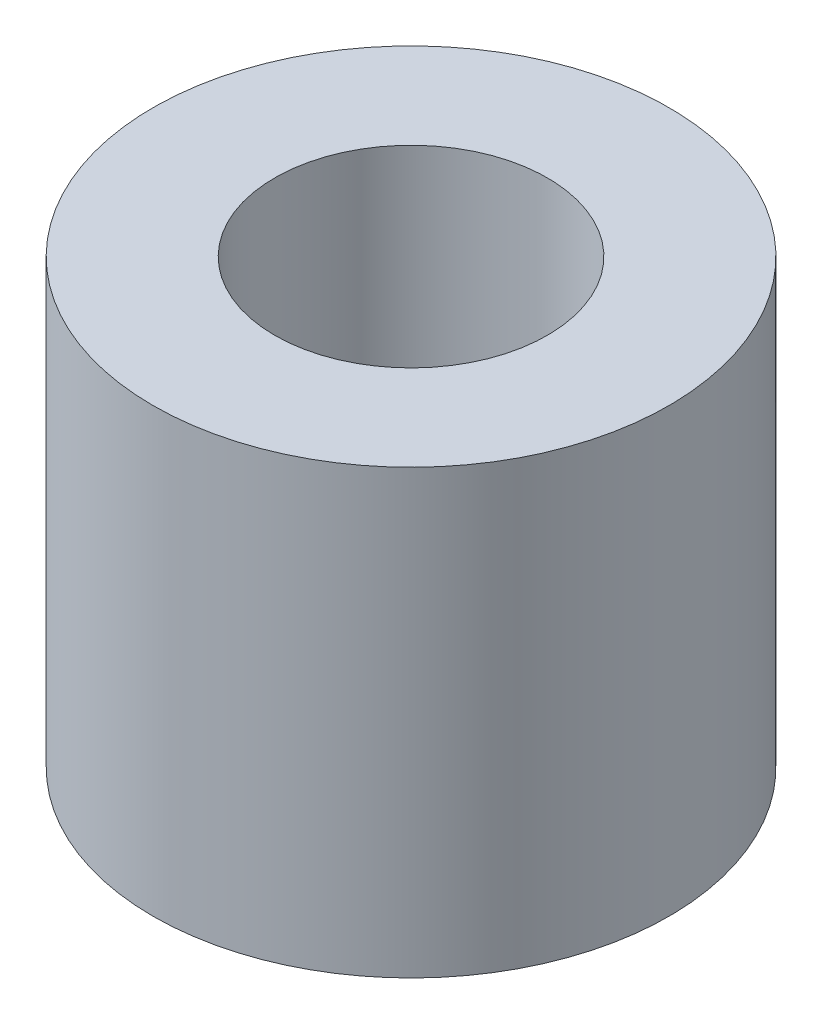
ISO-10303-21;
HEADER;
FILE_DESCRIPTION(('STEP AP214'),'2;1');
FILE_NAME('part.step','',(''),(''),'','','');
FILE_SCHEMA(('AUTOMOTIVE_DESIGN { 1 0 10303 214 1 1 1 1 }'));
ENDSEC;
DATA;
#1=APPLICATION_CONTEXT('core data for automotive mechanical design processes');
#2=APPLICATION_PROTOCOL_DEFINITION('international standard','automotive_design',2000,#1);
#3=PRODUCT_CONTEXT('',#1,'mechanical');
#4=PRODUCT('Part','Part','',(#3));
#5=PRODUCT_RELATED_PRODUCT_CATEGORY('part','',(#4));
#6=PRODUCT_DEFINITION_FORMATION('','',#4);
#7=PRODUCT_DEFINITION_CONTEXT('part definition',#1,'design');
#8=PRODUCT_DEFINITION('design','',#6,#7);
#9=PRODUCT_DEFINITION_SHAPE('','',#8);
#10=(LENGTH_UNIT() NAMED_UNIT(*) SI_UNIT(.MILLI.,.METRE.));
#11=(NAMED_UNIT(*) PLANE_ANGLE_UNIT() SI_UNIT($,.RADIAN.));
#12=(NAMED_UNIT(*) SI_UNIT($,.STERADIAN.) SOLID_ANGLE_UNIT());
#13=UNCERTAINTY_MEASURE_WITH_UNIT(LENGTH_MEASURE(1.E-05),#10,'distance_accuracy_value','');
#14=(GEOMETRIC_REPRESENTATION_CONTEXT(3) GLOBAL_UNCERTAINTY_ASSIGNED_CONTEXT((#13)) GLOBAL_UNIT_ASSIGNED_CONTEXT((#10,
#11,#12)) REPRESENTATION_CONTEXT('',''));
#15=CARTESIAN_POINT('',(0.,0.,0.));
#16=DIRECTION('',(0.,0.,1.));
#17=DIRECTION('',(1.,0.,0.));
#18=AXIS2_PLACEMENT_3D('',#15,#16,#17);
#19=CARTESIAN_POINT('',(0.,6.,0.));
#20=DIRECTION('',(0.,1.,0.));
#21=DIRECTION('',(0.,0.,1.));
#22=AXIS2_PLACEMENT_3D('',#19,#20,#21);
#23=PLANE('',#22);
#24=CARTESIAN_POINT('',(0.,6.,0.));
#25=DIRECTION('',(0.,1.,0.));
#26=DIRECTION('',(0.,0.,1.));
#27=AXIS2_PLACEMENT_3D('',#24,#25,#26);
#28=CIRCLE('',#27,3.5);
#29=CARTESIAN_POINT('',(0.,6.,3.5));
#30=VERTEX_POINT('',#29);
#31=EDGE_CURVE('E10',#30,#30,#28,.T.);
#32=ORIENTED_EDGE('',*,*,#31,.T.);
#33=EDGE_LOOP('',(#32));
#34=FACE_BOUND('',#33,.T.);
#35=CARTESIAN_POINT('',(0.,6.,0.));
#36=DIRECTION('',(0.,1.,0.));
#37=DIRECTION('',(0.,0.,1.));
#38=AXIS2_PLACEMENT_3D('',#35,#36,#37);
#39=CIRCLE('',#38,1.85);
#40=CARTESIAN_POINT('',(0.,6.,1.85));
#41=VERTEX_POINT('',#40);
#42=EDGE_CURVE('E45',#41,#41,#39,.T.);
#43=ORIENTED_EDGE('',*,*,#42,.F.);
#44=EDGE_LOOP('',(#43));
#45=FACE_BOUND('',#44,.T.);
#46=ADVANCED_FACE('F34',(#34,#45),#23,.T.);
#47=CARTESIAN_POINT('',(0.,0.,0.));
#48=DIRECTION('',(0.,1.,0.));
#49=DIRECTION('',(0.,0.,1.));
#50=AXIS2_PLACEMENT_3D('',#47,#48,#49);
#51=PLANE('',#50);
#52=CARTESIAN_POINT('',(0.,0.,0.));
#53=DIRECTION('',(0.,1.,0.));
#54=DIRECTION('',(0.,0.,1.));
#55=AXIS2_PLACEMENT_3D('',#52,#53,#54);
#56=CIRCLE('',#55,3.5);
#57=CARTESIAN_POINT('',(0.,0.,3.5));
#58=VERTEX_POINT('',#57);
#59=EDGE_CURVE('E38',#58,#58,#56,.T.);
#60=ORIENTED_EDGE('',*,*,#59,.F.);
#61=EDGE_LOOP('',(#60));
#62=FACE_BOUND('',#61,.T.);
#63=CARTESIAN_POINT('',(0.,0.,0.));
#64=DIRECTION('',(0.,1.,0.));
#65=DIRECTION('',(0.,0.,1.));
#66=AXIS2_PLACEMENT_3D('',#63,#64,#65);
#67=CIRCLE('',#66,1.85);
#68=CARTESIAN_POINT('',(0.,0.,1.85));
#69=VERTEX_POINT('',#68);
#70=EDGE_CURVE('E47',#69,#69,#67,.T.);
#71=ORIENTED_EDGE('',*,*,#70,.T.);
#72=EDGE_LOOP('',(#71));
#73=FACE_BOUND('',#72,.T.);
#74=ADVANCED_FACE('F57',(#62,#73),#51,.F.);
#75=CARTESIAN_POINT('',(0.,6.,0.));
#76=DIRECTION('',(0.,-1.,0.));
#77=DIRECTION('',(0.,0.,-1.));
#78=AXIS2_PLACEMENT_3D('',#75,#76,#77);
#79=CYLINDRICAL_SURFACE('',#78,3.5);
#80=ORIENTED_EDGE('',*,*,#31,.F.);
#81=EDGE_LOOP('',(#80));
#82=FACE_BOUND('',#81,.T.);
#83=ORIENTED_EDGE('',*,*,#59,.T.);
#84=EDGE_LOOP('',(#83));
#85=FACE_BOUND('',#84,.T.);
#86=ADVANCED_FACE('F36',(#82,#85),#79,.T.);
#87=CARTESIAN_POINT('',(0.,6.,0.));
#88=DIRECTION('',(0.,-1.,0.));
#89=DIRECTION('',(0.,0.,-1.));
#90=AXIS2_PLACEMENT_3D('',#87,#88,#89);
#91=CYLINDRICAL_SURFACE('',#90,1.85);
#92=ORIENTED_EDGE('',*,*,#42,.T.);
#93=EDGE_LOOP('',(#92));
#94=FACE_BOUND('',#93,.T.);
#95=ORIENTED_EDGE('',*,*,#70,.F.);
#96=EDGE_LOOP('',(#95));
#97=FACE_BOUND('',#96,.T.);
#98=ADVANCED_FACE('F53',(#94,#97),#91,.F.);
#99=CLOSED_SHELL('',(#46,#74,#86,#98));
#100=MANIFOLD_SOLID_BREP('B2',#99);
#101=ADVANCED_BREP_SHAPE_REPRESENTATION('',(#18,#100),#14);
#102=SHAPE_DEFINITION_REPRESENTATION(#9,#101);
ENDSEC;
END-ISO-10303-21;
